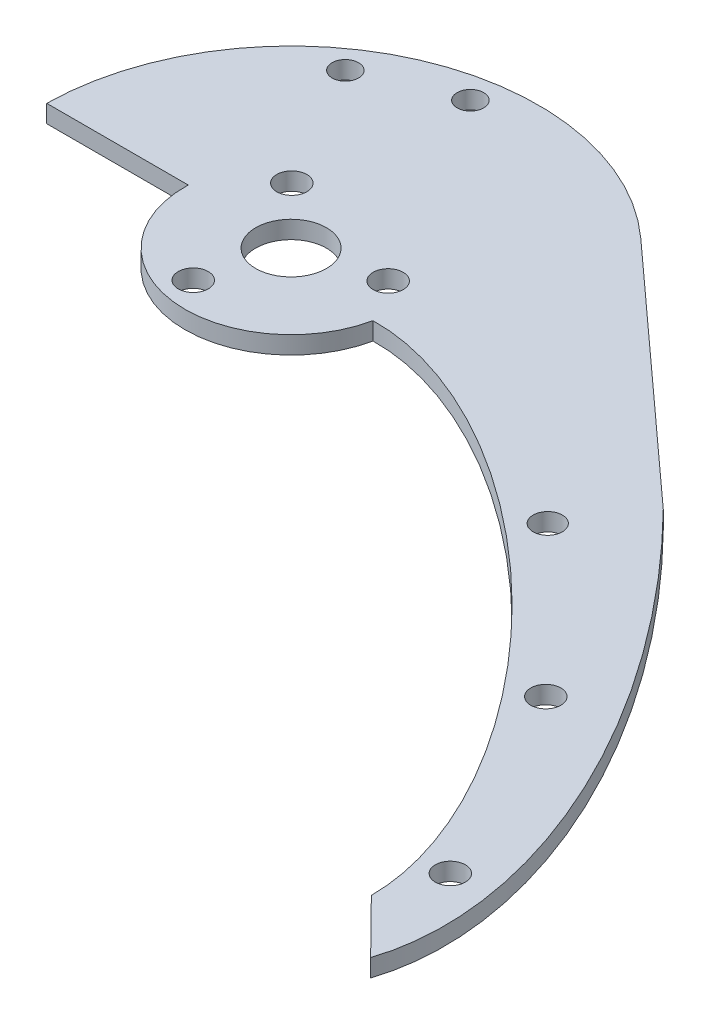
ISO-10303-21;
HEADER;
FILE_DESCRIPTION(('STEP AP214'),'2;1');
FILE_NAME('part.step','',(''),(''),'','','');
FILE_SCHEMA(('AUTOMOTIVE_DESIGN { 1 0 10303 214 1 1 1 1 }'));
ENDSEC;
DATA;
#1=APPLICATION_CONTEXT('core data for automotive mechanical design processes');
#2=APPLICATION_PROTOCOL_DEFINITION('international standard','automotive_design',2000,#1);
#3=PRODUCT_CONTEXT('',#1,'mechanical');
#4=PRODUCT('Part','Part','',(#3));
#5=PRODUCT_RELATED_PRODUCT_CATEGORY('part','',(#4));
#6=PRODUCT_DEFINITION_FORMATION('','',#4);
#7=PRODUCT_DEFINITION_CONTEXT('part definition',#1,'design');
#8=PRODUCT_DEFINITION('design','',#6,#7);
#9=PRODUCT_DEFINITION_SHAPE('','',#8);
#10=(LENGTH_UNIT() NAMED_UNIT(*) SI_UNIT(.MILLI.,.METRE.));
#11=(NAMED_UNIT(*) PLANE_ANGLE_UNIT() SI_UNIT($,.RADIAN.));
#12=(NAMED_UNIT(*) SI_UNIT($,.STERADIAN.) SOLID_ANGLE_UNIT());
#13=UNCERTAINTY_MEASURE_WITH_UNIT(LENGTH_MEASURE(1.E-05),#10,'distance_accuracy_value','');
#14=(GEOMETRIC_REPRESENTATION_CONTEXT(3) GLOBAL_UNCERTAINTY_ASSIGNED_CONTEXT((#13)) GLOBAL_UNIT_ASSIGNED_CONTEXT((#10,
#11,#12)) REPRESENTATION_CONTEXT('',''));
#15=CARTESIAN_POINT('',(0.,0.,0.));
#16=DIRECTION('',(0.,0.,1.));
#17=DIRECTION('',(1.,0.,0.));
#18=AXIS2_PLACEMENT_3D('',#15,#16,#17);
#19=CARTESIAN_POINT('',(35.1255795593791,2.,35.5836150583064));
#20=DIRECTION('',(0.,1.,0.));
#21=DIRECTION('',(0.,0.,1.));
#22=AXIS2_PLACEMENT_3D('',#19,#20,#21);
#23=PLANE('',#22);
#24=CARTESIAN_POINT('',(41.4835959621782,2.,12.4554883742596));
#25=DIRECTION('',(0.,1.,0.));
#26=DIRECTION('',(0.,0.,1.));
#27=AXIS2_PLACEMENT_3D('',#24,#25,#26);
#28=CIRCLE('',#27,1.65);
#29=CARTESIAN_POINT('',(41.4835959621782,2.,14.1054883742596));
#30=VERTEX_POINT('',#29);
#31=EDGE_CURVE('E194',#30,#30,#28,.T.);
#32=ORIENTED_EDGE('',*,*,#31,.F.);
#33=EDGE_LOOP('',(#32));
#34=FACE_BOUND('',#33,.T.);
#35=CARTESIAN_POINT('',(70.257880668249,2.,52.2439784797545));
#36=DIRECTION('',(0.,1.,0.));
#37=DIRECTION('',(0.,0.,1.));
#38=AXIS2_PLACEMENT_3D('',#35,#36,#37);
#39=CIRCLE('',#38,1.7);
#40=CARTESIAN_POINT('',(70.257880668249,2.,53.9439784797545));
#41=VERTEX_POINT('',#40);
#42=EDGE_CURVE('E200',#41,#41,#39,.T.);
#43=ORIENTED_EDGE('',*,*,#42,.F.);
#44=EDGE_LOOP('',(#43));
#45=FACE_BOUND('',#44,.T.);
#46=CARTESIAN_POINT('',(58.3341330111079,2.,29.5257554387853));
#47=DIRECTION('',(0.,1.,0.));
#48=DIRECTION('',(0.,0.,1.));
#49=AXIS2_PLACEMENT_3D('',#46,#47,#48);
#50=CIRCLE('',#49,1.7);
#51=CARTESIAN_POINT('',(58.3341330111079,2.,31.2257554387853));
#52=VERTEX_POINT('',#51);
#53=EDGE_CURVE('E182',#52,#52,#50,.T.);
#54=ORIENTED_EDGE('',*,*,#53,.F.);
#55=EDGE_LOOP('',(#54));
#56=FACE_BOUND('',#55,.T.);
#57=CARTESIAN_POINT('',(-14.3394109087762,2.,-20.4788011072248));
#58=DIRECTION('',(0.,1.,0.));
#59=DIRECTION('',(0.,0.,-1.));
#60=AXIS2_PLACEMENT_3D('',#57,#58,#59);
#61=CIRCLE('',#60,1.5);
#62=CARTESIAN_POINT('',(-14.3394109087762,2.,-21.9788011072248));
#63=VERTEX_POINT('',#62);
#64=EDGE_CURVE('E189',#63,#63,#61,.T.);
#65=ORIENTED_EDGE('',*,*,#64,.F.);
#66=EDGE_LOOP('',(#65));
#67=FACE_BOUND('',#66,.T.);
#68=CARTESIAN_POINT('',(-4.34120444167328,2.,-24.6201938253052));
#69=DIRECTION('',(0.,1.,0.));
#70=DIRECTION('',(0.,0.,1.));
#71=AXIS2_PLACEMENT_3D('',#68,#69,#70);
#72=CIRCLE('',#71,1.5);
#73=CARTESIAN_POINT('',(-4.34120444167328,2.,-23.1201938253052));
#74=VERTEX_POINT('',#73);
#75=EDGE_CURVE('E176',#74,#74,#72,.T.);
#76=ORIENTED_EDGE('',*,*,#75,.F.);
#77=EDGE_LOOP('',(#76));
#78=FACE_BOUND('',#77,.T.);
#79=CARTESIAN_POINT('',(8.70823878816048,2.,-2.2730106045457));
#80=DIRECTION('',(0.,1.,0.));
#81=DIRECTION('',(0.,0.,1.));
#82=AXIS2_PLACEMENT_3D('',#79,#80,#81);
#83=CIRCLE('',#82,1.7);
#84=CARTESIAN_POINT('',(8.70823878816048,2.,-0.573010604545707));
#85=VERTEX_POINT('',#84);
#86=EDGE_CURVE('E161',#85,#85,#83,.T.);
#87=ORIENTED_EDGE('',*,*,#86,.F.);
#88=EDGE_LOOP('',(#87));
#89=FACE_BOUND('',#88,.T.);
#90=CARTESIAN_POINT('',(0.,2.,0.));
#91=DIRECTION('',(0.,1.,0.));
#92=DIRECTION('',(0.,0.,1.));
#93=AXIS2_PLACEMENT_3D('',#90,#91,#92);
#94=CIRCLE('',#93,4.);
#95=CARTESIAN_POINT('',(0.,2.,4.));
#96=VERTEX_POINT('',#95);
#97=EDGE_CURVE('E153',#96,#96,#94,.T.);
#98=ORIENTED_EDGE('',*,*,#97,.F.);
#99=EDGE_LOOP('',(#98));
#100=FACE_BOUND('',#99,.T.);
#101=CARTESIAN_POINT('',(0.,2.,0.));
#102=DIRECTION('',(0.,1.,0.));
#103=DIRECTION('',(0.,0.,1.));
#104=AXIS2_PLACEMENT_3D('',#101,#102,#103);
#105=CIRCLE('',#104,28.);
#106=CARTESIAN_POINT('',(18.8288086844172,2.,-20.7238018598329));
#107=VERTEX_POINT('',#106);
#108=CARTESIAN_POINT('',(-27.9976502789953,2.,-0.362737997837238));
#109=VERTEX_POINT('',#108);
#110=EDGE_CURVE('E52',#107,#109,#105,.T.);
#111=ORIENTED_EDGE('',*,*,#110,.T.);
#112=DIRECTION('',(1.,0.,0.));
#113=VECTOR('',#112,1.);
#114=CARTESIAN_POINT('',(-11.9945162947459,2.,-0.362737997837313));
#115=LINE('',#114,#113);
#116=CARTESIAN_POINT('',(-11.9945162947459,2.,-0.362737997837313));
#117=VERTEX_POINT('',#116);
#118=EDGE_CURVE('E93',#109,#117,#115,.T.);
#119=ORIENTED_EDGE('',*,*,#118,.T.);
#120=CARTESIAN_POINT('',(0.,2.,0.));
#121=DIRECTION('',(0.,1.,0.));
#122=DIRECTION('',(0.,0.,1.));
#123=AXIS2_PLACEMENT_3D('',#120,#121,#122);
#124=CIRCLE('',#123,12.);
#125=CARTESIAN_POINT('',(11.7417923440434,2.,2.47594679857322));
#126=VERTEX_POINT('',#125);
#127=EDGE_CURVE('E145',#117,#126,#124,.T.);
#128=ORIENTED_EDGE('',*,*,#127,.T.);
#129=CARTESIAN_POINT('',(35.1255795593791,2.,35.5836150583064));
#130=DIRECTION('',(0.,-1.,0.));
#131=DIRECTION('',(-0.702511591187581,0.,-0.711672301166129));
#132=AXIS2_PLACEMENT_3D('',#129,#130,#131);
#133=ELLIPSE('',#132,43.,18.);
#134=CARTESIAN_POINT('',(67.9374513426321,2.,58.8591033245058));
#135=VERTEX_POINT('',#134);
#136=EDGE_CURVE('E110',#126,#135,#133,.T.);
#137=ORIENTED_EDGE('',*,*,#136,.T.);
#138=DIRECTION('',(0.70251159118758,0.,0.71167230116613));
#139=VECTOR('',#138,1.);
#140=CARTESIAN_POINT('',(67.9374513426321,2.,58.8591033245058));
#141=LINE('',#140,#139);
#142=CARTESIAN_POINT('',(73.9918053149363,2.,64.9924057177948));
#143=VERTEX_POINT('',#142);
#144=EDGE_CURVE('E104',#135,#143,#141,.T.);
#145=ORIENTED_EDGE('',*,*,#144,.T.);
#146=CARTESIAN_POINT('',(25.290417282753,2.,25.6202028419806));
#147=DIRECTION('',(0.,1.,0.));
#148=DIRECTION('',(0.702511591187581,0.,0.711672301166129));
#149=AXIS2_PLACEMENT_3D('',#146,#147,#148);
#150=ELLIPSE('',#149,64.,30.);
#151=CARTESIAN_POINT('',(46.6405863177367,2.,4.54485510635302));
#152=VERTEX_POINT('',#151);
#153=EDGE_CURVE('E108',#143,#152,#150,.T.);
#154=ORIENTED_EDGE('',*,*,#153,.T.);
#155=DIRECTION('',(-0.740135780708319,0.,-0.672457453014901));
#156=VECTOR('',#155,1.);
#157=CARTESIAN_POINT('',(46.6405863177367,2.,4.54485510635303));
#158=LINE('',#157,#156);
#159=EDGE_CURVE('E124',#152,#107,#158,.T.);
#160=ORIENTED_EDGE('',*,*,#159,.T.);
#161=EDGE_LOOP('',(#111,#119,#128,#137,#145,#154,#160));
#162=FACE_BOUND('',#161,.T.);
#163=CARTESIAN_POINT('',(-6.32260432068822,2.,-6.40505071049517));
#164=DIRECTION('',(0.,1.,0.));
#165=DIRECTION('',(0.,0.,1.));
#166=AXIS2_PLACEMENT_3D('',#163,#164,#165);
#167=CIRCLE('',#166,1.7);
#168=CARTESIAN_POINT('',(-6.32260432068822,2.,-4.70505071049517));
#169=VERTEX_POINT('',#168);
#170=EDGE_CURVE('E154',#169,#169,#167,.T.);
#171=ORIENTED_EDGE('',*,*,#170,.F.);
#172=EDGE_LOOP('',(#171));
#173=FACE_BOUND('',#172,.T.);
#174=CARTESIAN_POINT('',(-2.38563446747228,2.,8.67806131504083));
#175=DIRECTION('',(0.,1.,0.));
#176=DIRECTION('',(0.,0.,1.));
#177=AXIS2_PLACEMENT_3D('',#174,#175,#176);
#178=CIRCLE('',#177,1.7);
#179=CARTESIAN_POINT('',(-2.38563446747228,2.,10.3780613150408));
#180=VERTEX_POINT('',#179);
#181=EDGE_CURVE('E167',#180,#180,#178,.T.);
#182=ORIENTED_EDGE('',*,*,#181,.F.);
#183=EDGE_LOOP('',(#182));
#184=FACE_BOUND('',#183,.T.);
#185=ADVANCED_FACE('F35',(#34,#45,#56,#67,#78,#89,#100,#162,#173,#184),#23,.T.);
#186=CARTESIAN_POINT('',(35.1255795593791,0.,35.5836150583064));
#187=DIRECTION('',(0.,1.,0.));
#188=DIRECTION('',(0.,0.,1.));
#189=AXIS2_PLACEMENT_3D('',#186,#187,#188);
#190=PLANE('',#189);
#191=CARTESIAN_POINT('',(41.4835959621782,0.,12.4554883742596));
#192=DIRECTION('',(0.,1.,0.));
#193=DIRECTION('',(0.,0.,1.));
#194=AXIS2_PLACEMENT_3D('',#191,#192,#193);
#195=CIRCLE('',#194,1.65);
#196=CARTESIAN_POINT('',(41.4835959621782,0.,14.1054883742596));
#197=VERTEX_POINT('',#196);
#198=EDGE_CURVE('E197',#197,#197,#195,.T.);
#199=ORIENTED_EDGE('',*,*,#198,.T.);
#200=EDGE_LOOP('',(#199));
#201=FACE_BOUND('',#200,.T.);
#202=CARTESIAN_POINT('',(70.257880668249,0.,52.2439784797545));
#203=DIRECTION('',(0.,1.,0.));
#204=DIRECTION('',(0.,0.,1.));
#205=AXIS2_PLACEMENT_3D('',#202,#203,#204);
#206=CIRCLE('',#205,1.7);
#207=CARTESIAN_POINT('',(70.257880668249,0.,53.9439784797545));
#208=VERTEX_POINT('',#207);
#209=EDGE_CURVE('E186',#208,#208,#206,.T.);
#210=ORIENTED_EDGE('',*,*,#209,.T.);
#211=EDGE_LOOP('',(#210));
#212=FACE_BOUND('',#211,.T.);
#213=CARTESIAN_POINT('',(58.3341330111079,0.,29.5257554387853));
#214=DIRECTION('',(0.,1.,0.));
#215=DIRECTION('',(0.,0.,1.));
#216=AXIS2_PLACEMENT_3D('',#213,#214,#215);
#217=CIRCLE('',#216,1.7);
#218=CARTESIAN_POINT('',(58.3341330111079,0.,31.2257554387853));
#219=VERTEX_POINT('',#218);
#220=EDGE_CURVE('E185',#219,#219,#217,.T.);
#221=ORIENTED_EDGE('',*,*,#220,.T.);
#222=EDGE_LOOP('',(#221));
#223=FACE_BOUND('',#222,.T.);
#224=CARTESIAN_POINT('',(-14.3394109087762,0.,-20.4788011072248));
#225=DIRECTION('',(0.,1.,0.));
#226=DIRECTION('',(0.,0.,-1.));
#227=AXIS2_PLACEMENT_3D('',#224,#225,#226);
#228=CIRCLE('',#227,1.5);
#229=CARTESIAN_POINT('',(-14.3394109087762,0.,-21.9788011072248));
#230=VERTEX_POINT('',#229);
#231=EDGE_CURVE('E179',#230,#230,#228,.T.);
#232=ORIENTED_EDGE('',*,*,#231,.T.);
#233=EDGE_LOOP('',(#232));
#234=FACE_BOUND('',#233,.T.);
#235=CARTESIAN_POINT('',(-4.34120444167328,0.,-24.6201938253052));
#236=DIRECTION('',(0.,1.,0.));
#237=DIRECTION('',(0.,0.,1.));
#238=AXIS2_PLACEMENT_3D('',#235,#236,#237);
#239=CIRCLE('',#238,1.5);
#240=CARTESIAN_POINT('',(-4.34120444167328,0.,-23.1201938253052));
#241=VERTEX_POINT('',#240);
#242=EDGE_CURVE('E173',#241,#241,#239,.T.);
#243=ORIENTED_EDGE('',*,*,#242,.T.);
#244=EDGE_LOOP('',(#243));
#245=FACE_BOUND('',#244,.T.);
#246=DIRECTION('',(1.,0.,0.));
#247=VECTOR('',#246,1.);
#248=CARTESIAN_POINT('',(-11.9945162947459,0.,-0.362737997837313));
#249=LINE('',#248,#247);
#250=CARTESIAN_POINT('',(-27.9976502789953,0.,-0.362737997837238));
#251=VERTEX_POINT('',#250);
#252=CARTESIAN_POINT('',(-11.9945162947459,0.,-0.362737997837313));
#253=VERTEX_POINT('',#252);
#254=EDGE_CURVE('E157',#251,#253,#249,.T.);
#255=ORIENTED_EDGE('',*,*,#254,.F.);
#256=CARTESIAN_POINT('',(0.,0.,0.));
#257=DIRECTION('',(0.,1.,0.));
#258=DIRECTION('',(0.,0.,-1.));
#259=AXIS2_PLACEMENT_3D('',#256,#257,#258);
#260=CIRCLE('',#259,28.);
#261=CARTESIAN_POINT('',(18.8288086844172,0.,-20.7238018598329));
#262=VERTEX_POINT('',#261);
#263=EDGE_CURVE('E149',#262,#251,#260,.T.);
#264=ORIENTED_EDGE('',*,*,#263,.F.);
#265=DIRECTION('',(-0.740135780708319,0.,-0.672457453014901));
#266=VECTOR('',#265,1.);
#267=CARTESIAN_POINT('',(46.6405863177367,0.,4.54485510635303));
#268=LINE('',#267,#266);
#269=CARTESIAN_POINT('',(46.6405863177367,0.,4.54485510635302));
#270=VERTEX_POINT('',#269);
#271=EDGE_CURVE('E86',#270,#262,#268,.T.);
#272=ORIENTED_EDGE('',*,*,#271,.F.);
#273=CARTESIAN_POINT('',(25.290417282753,0.,25.6202028419806));
#274=DIRECTION('',(0.,1.,0.));
#275=DIRECTION('',(0.702511591187581,0.,0.711672301166129));
#276=AXIS2_PLACEMENT_3D('',#273,#274,#275);
#277=ELLIPSE('',#276,64.,30.);
#278=CARTESIAN_POINT('',(73.9918053149363,0.,64.9924057177948));
#279=VERTEX_POINT('',#278);
#280=EDGE_CURVE('E79',#279,#270,#277,.T.);
#281=ORIENTED_EDGE('',*,*,#280,.F.);
#282=DIRECTION('',(0.70251159118758,0.,0.71167230116613));
#283=VECTOR('',#282,1.);
#284=CARTESIAN_POINT('',(67.9374513426321,0.,58.8591033245058));
#285=LINE('',#284,#283);
#286=CARTESIAN_POINT('',(67.9374513426321,0.,58.8591033245058));
#287=VERTEX_POINT('',#286);
#288=EDGE_CURVE('E118',#287,#279,#285,.T.);
#289=ORIENTED_EDGE('',*,*,#288,.F.);
#290=CARTESIAN_POINT('',(35.1255795593791,0.,35.5836150583064));
#291=DIRECTION('',(0.,-1.,0.));
#292=DIRECTION('',(-0.702511591187581,0.,-0.711672301166129));
#293=AXIS2_PLACEMENT_3D('',#290,#291,#292);
#294=ELLIPSE('',#293,43.,18.);
#295=CARTESIAN_POINT('',(11.7417923440434,0.,2.47594679857322));
#296=VERTEX_POINT('',#295);
#297=EDGE_CURVE('E291',#296,#287,#294,.T.);
#298=ORIENTED_EDGE('',*,*,#297,.F.);
#299=CARTESIAN_POINT('',(0.,0.,0.));
#300=DIRECTION('',(0.,1.,0.));
#301=DIRECTION('',(0.,0.,1.));
#302=AXIS2_PLACEMENT_3D('',#299,#300,#301);
#303=CIRCLE('',#302,12.);
#304=EDGE_CURVE('E278',#253,#296,#303,.T.);
#305=ORIENTED_EDGE('',*,*,#304,.F.);
#306=EDGE_LOOP('',(#255,#264,#272,#281,#289,#298,#305));
#307=FACE_BOUND('',#306,.T.);
#308=CARTESIAN_POINT('',(0.,0.,0.));
#309=DIRECTION('',(0.,1.,0.));
#310=DIRECTION('',(0.,0.,1.));
#311=AXIS2_PLACEMENT_3D('',#308,#309,#310);
#312=CIRCLE('',#311,4.);
#313=CARTESIAN_POINT('',(0.,0.,4.));
#314=VERTEX_POINT('',#313);
#315=EDGE_CURVE('E150',#314,#314,#312,.T.);
#316=ORIENTED_EDGE('',*,*,#315,.T.);
#317=EDGE_LOOP('',(#316));
#318=FACE_BOUND('',#317,.T.);
#319=CARTESIAN_POINT('',(-6.32260432068822,0.,-6.40505071049517));
#320=DIRECTION('',(0.,1.,0.));
#321=DIRECTION('',(0.,0.,1.));
#322=AXIS2_PLACEMENT_3D('',#319,#320,#321);
#323=CIRCLE('',#322,1.7);
#324=CARTESIAN_POINT('',(-6.32260432068822,0.,-4.70505071049517));
#325=VERTEX_POINT('',#324);
#326=EDGE_CURVE('E158',#325,#325,#323,.T.);
#327=ORIENTED_EDGE('',*,*,#326,.T.);
#328=EDGE_LOOP('',(#327));
#329=FACE_BOUND('',#328,.T.);
#330=CARTESIAN_POINT('',(8.70823878816048,0.,-2.2730106045457));
#331=DIRECTION('',(0.,1.,0.));
#332=DIRECTION('',(0.,0.,1.));
#333=AXIS2_PLACEMENT_3D('',#330,#331,#332);
#334=CIRCLE('',#333,1.7);
#335=CARTESIAN_POINT('',(8.70823878816048,0.,-0.573010604545707));
#336=VERTEX_POINT('',#335);
#337=EDGE_CURVE('E164',#336,#336,#334,.T.);
#338=ORIENTED_EDGE('',*,*,#337,.T.);
#339=EDGE_LOOP('',(#338));
#340=FACE_BOUND('',#339,.T.);
#341=CARTESIAN_POINT('',(-2.38563446747228,0.,8.67806131504083));
#342=DIRECTION('',(0.,1.,0.));
#343=DIRECTION('',(0.,0.,1.));
#344=AXIS2_PLACEMENT_3D('',#341,#342,#343);
#345=CIRCLE('',#344,1.7);
#346=CARTESIAN_POINT('',(-2.38563446747228,0.,10.3780613150408));
#347=VERTEX_POINT('',#346);
#348=EDGE_CURVE('E170',#347,#347,#345,.T.);
#349=ORIENTED_EDGE('',*,*,#348,.T.);
#350=EDGE_LOOP('',(#349));
#351=FACE_BOUND('',#350,.T.);
#352=ADVANCED_FACE('F206',(#201,#212,#223,#234,#245,#307,#318,#329,#340,#351),#190,.F.);
#353=CARTESIAN_POINT('',(-11.9945162947459,2.,-0.362737997837313));
#354=DIRECTION('',(0.,0.,-1.));
#355=DIRECTION('',(-1.,0.,0.));
#356=AXIS2_PLACEMENT_3D('',#353,#354,#355);
#357=PLANE('',#356);
#358=ORIENTED_EDGE('',*,*,#254,.T.);
#359=DIRECTION('',(0.,-1.,0.));
#360=VECTOR('',#359,1.);
#361=CARTESIAN_POINT('',(-11.9945162947459,2.,-0.362737997837313));
#362=LINE('',#361,#360);
#363=EDGE_CURVE('E44',#117,#253,#362,.T.);
#364=ORIENTED_EDGE('',*,*,#363,.F.);
#365=ORIENTED_EDGE('',*,*,#118,.F.);
#366=DIRECTION('',(0.,-1.,0.));
#367=VECTOR('',#366,1.);
#368=CARTESIAN_POINT('',(-27.9976502789953,2.,-0.362737997837238));
#369=LINE('',#368,#367);
#370=EDGE_CURVE('E11',#109,#251,#369,.T.);
#371=ORIENTED_EDGE('',*,*,#370,.T.);
#372=EDGE_LOOP('',(#358,#364,#365,#371));
#373=FACE_BOUND('',#372,.T.);
#374=ADVANCED_FACE('F37',(#373),#357,.F.);
#375=CARTESIAN_POINT('',(0.,2.,0.));
#376=DIRECTION('',(0.,-1.,0.));
#377=DIRECTION('',(0.,0.,-1.));
#378=AXIS2_PLACEMENT_3D('',#375,#376,#377);
#379=CYLINDRICAL_SURFACE('',#378,12.);
#380=ORIENTED_EDGE('',*,*,#304,.T.);
#381=DIRECTION('',(0.,-1.,0.));
#382=VECTOR('',#381,1.);
#383=CARTESIAN_POINT('',(11.7417923440434,2.,2.47594679857322));
#384=LINE('',#383,#382);
#385=EDGE_CURVE('E290',#126,#296,#384,.T.);
#386=ORIENTED_EDGE('',*,*,#385,.F.);
#387=ORIENTED_EDGE('',*,*,#127,.F.);
#388=ORIENTED_EDGE('',*,*,#363,.T.);
#389=EDGE_LOOP('',(#380,#386,#387,#388));
#390=FACE_BOUND('',#389,.T.);
#391=ADVANCED_FACE('F141',(#390),#379,.T.);
#392=DIRECTION('',(0.,-1.,0.));
#393=VECTOR('',#392,1.);
#394=SURFACE_OF_LINEAR_EXTRUSION('',#133,#393);
#395=ORIENTED_EDGE('',*,*,#297,.T.);
#396=DIRECTION('',(0.,-1.,0.));
#397=VECTOR('',#396,1.);
#398=CARTESIAN_POINT('',(67.9374513426321,2.,58.8591033245058));
#399=LINE('',#398,#397);
#400=EDGE_CURVE('E119',#135,#287,#399,.T.);
#401=ORIENTED_EDGE('',*,*,#400,.F.);
#402=ORIENTED_EDGE('',*,*,#136,.F.);
#403=ORIENTED_EDGE('',*,*,#385,.T.);
#404=EDGE_LOOP('',(#395,#401,#402,#403));
#405=FACE_BOUND('',#404,.T.);
#406=ADVANCED_FACE('F139',(#405),#394,.F.);
#407=CARTESIAN_POINT('',(67.9374513426321,2.,58.8591033245058));
#408=DIRECTION('',(0.71167230116613,0.,-0.70251159118758));
#409=DIRECTION('',(-0.70251159118758,0.,-0.71167230116613));
#410=AXIS2_PLACEMENT_3D('',#407,#408,#409);
#411=PLANE('',#410);
#412=ORIENTED_EDGE('',*,*,#288,.T.);
#413=DIRECTION('',(0.,-1.,0.));
#414=VECTOR('',#413,1.);
#415=CARTESIAN_POINT('',(73.9918053149363,2.,64.9924057177948));
#416=LINE('',#415,#414);
#417=EDGE_CURVE('E115',#143,#279,#416,.T.);
#418=ORIENTED_EDGE('',*,*,#417,.F.);
#419=ORIENTED_EDGE('',*,*,#144,.F.);
#420=ORIENTED_EDGE('',*,*,#400,.T.);
#421=EDGE_LOOP('',(#412,#418,#419,#420));
#422=FACE_BOUND('',#421,.T.);
#423=ADVANCED_FACE('F116',(#422),#411,.F.);
#424=DIRECTION('',(0.,-1.,0.));
#425=VECTOR('',#424,1.);
#426=SURFACE_OF_LINEAR_EXTRUSION('',#150,#425);
#427=ORIENTED_EDGE('',*,*,#280,.T.);
#428=DIRECTION('',(0.,-1.,0.));
#429=VECTOR('',#428,1.);
#430=CARTESIAN_POINT('',(46.6405863177367,2.,4.54485510635302));
#431=LINE('',#430,#429);
#432=EDGE_CURVE('E120',#152,#270,#431,.T.);
#433=ORIENTED_EDGE('',*,*,#432,.F.);
#434=ORIENTED_EDGE('',*,*,#153,.F.);
#435=ORIENTED_EDGE('',*,*,#417,.T.);
#436=EDGE_LOOP('',(#427,#433,#434,#435));
#437=FACE_BOUND('',#436,.T.);
#438=ADVANCED_FACE('F122',(#437),#426,.F.);
#439=CARTESIAN_POINT('',(46.6405863177367,2.,4.54485510635303));
#440=DIRECTION('',(-0.672457453014901,0.,0.740135780708319));
#441=DIRECTION('',(0.740135780708319,0.,0.672457453014901));
#442=AXIS2_PLACEMENT_3D('',#439,#440,#441);
#443=PLANE('',#442);
#444=ORIENTED_EDGE('',*,*,#271,.T.);
#445=DIRECTION('',(0.,-1.,0.));
#446=VECTOR('',#445,1.);
#447=CARTESIAN_POINT('',(18.8288086844172,2.,-20.7238018598329));
#448=LINE('',#447,#446);
#449=EDGE_CURVE('E126',#107,#262,#448,.T.);
#450=ORIENTED_EDGE('',*,*,#449,.F.);
#451=ORIENTED_EDGE('',*,*,#159,.F.);
#452=ORIENTED_EDGE('',*,*,#432,.T.);
#453=EDGE_LOOP('',(#444,#450,#451,#452));
#454=FACE_BOUND('',#453,.T.);
#455=ADVANCED_FACE('F135',(#454),#443,.F.);
#456=CARTESIAN_POINT('',(0.,2.,0.));
#457=DIRECTION('',(0.,-1.,0.));
#458=DIRECTION('',(0.,0.,-1.));
#459=AXIS2_PLACEMENT_3D('',#456,#457,#458);
#460=CYLINDRICAL_SURFACE('',#459,28.);
#461=ORIENTED_EDGE('',*,*,#263,.T.);
#462=ORIENTED_EDGE('',*,*,#370,.F.);
#463=ORIENTED_EDGE('',*,*,#110,.F.);
#464=ORIENTED_EDGE('',*,*,#449,.T.);
#465=EDGE_LOOP('',(#461,#462,#463,#464));
#466=FACE_BOUND('',#465,.T.);
#467=ADVANCED_FACE('F235',(#466),#460,.T.);
#468=CARTESIAN_POINT('',(0.,2.,0.));
#469=DIRECTION('',(0.,-1.,0.));
#470=DIRECTION('',(0.,0.,-1.));
#471=AXIS2_PLACEMENT_3D('',#468,#469,#470);
#472=CYLINDRICAL_SURFACE('',#471,4.);
#473=ORIENTED_EDGE('',*,*,#97,.T.);
#474=EDGE_LOOP('',(#473));
#475=FACE_BOUND('',#474,.T.);
#476=ORIENTED_EDGE('',*,*,#315,.F.);
#477=EDGE_LOOP('',(#476));
#478=FACE_BOUND('',#477,.T.);
#479=ADVANCED_FACE('F231',(#475,#478),#472,.F.);
#480=CARTESIAN_POINT('',(-6.32260432068822,2.,-6.40505071049517));
#481=DIRECTION('',(0.,-1.,0.));
#482=DIRECTION('',(0.,0.,-1.));
#483=AXIS2_PLACEMENT_3D('',#480,#481,#482);
#484=CYLINDRICAL_SURFACE('',#483,1.7);
#485=ORIENTED_EDGE('',*,*,#170,.T.);
#486=EDGE_LOOP('',(#485));
#487=FACE_BOUND('',#486,.T.);
#488=ORIENTED_EDGE('',*,*,#326,.F.);
#489=EDGE_LOOP('',(#488));
#490=FACE_BOUND('',#489,.T.);
#491=ADVANCED_FACE('F234',(#487,#490),#484,.F.);
#492=CARTESIAN_POINT('',(8.70823878816048,2.,-2.2730106045457));
#493=DIRECTION('',(0.,-1.,0.));
#494=DIRECTION('',(0.,0.,-1.));
#495=AXIS2_PLACEMENT_3D('',#492,#493,#494);
#496=CYLINDRICAL_SURFACE('',#495,1.7);
#497=ORIENTED_EDGE('',*,*,#86,.T.);
#498=EDGE_LOOP('',(#497));
#499=FACE_BOUND('',#498,.T.);
#500=ORIENTED_EDGE('',*,*,#337,.F.);
#501=EDGE_LOOP('',(#500));
#502=FACE_BOUND('',#501,.T.);
#503=ADVANCED_FACE('F252',(#499,#502),#496,.F.);
#504=CARTESIAN_POINT('',(-2.38563446747228,2.,8.67806131504083));
#505=DIRECTION('',(0.,-1.,0.));
#506=DIRECTION('',(0.,0.,-1.));
#507=AXIS2_PLACEMENT_3D('',#504,#505,#506);
#508=CYLINDRICAL_SURFACE('',#507,1.7);
#509=ORIENTED_EDGE('',*,*,#181,.T.);
#510=EDGE_LOOP('',(#509));
#511=FACE_BOUND('',#510,.T.);
#512=ORIENTED_EDGE('',*,*,#348,.F.);
#513=EDGE_LOOP('',(#512));
#514=FACE_BOUND('',#513,.T.);
#515=ADVANCED_FACE('F249',(#511,#514),#508,.F.);
#516=CARTESIAN_POINT('',(-4.34120444167328,0.,-24.6201938253052));
#517=DIRECTION('',(0.,1.,0.));
#518=DIRECTION('',(0.,0.,1.));
#519=AXIS2_PLACEMENT_3D('',#516,#517,#518);
#520=CYLINDRICAL_SURFACE('',#519,1.5);
#521=ORIENTED_EDGE('',*,*,#242,.F.);
#522=EDGE_LOOP('',(#521));
#523=FACE_BOUND('',#522,.T.);
#524=ORIENTED_EDGE('',*,*,#75,.T.);
#525=EDGE_LOOP('',(#524));
#526=FACE_BOUND('',#525,.T.);
#527=ADVANCED_FACE('F251',(#523,#526),#520,.F.);
#528=CARTESIAN_POINT('',(-14.3394109087762,0.,-20.4788011072248));
#529=DIRECTION('',(0.,1.,0.));
#530=DIRECTION('',(0.,0.,1.));
#531=AXIS2_PLACEMENT_3D('',#528,#529,#530);
#532=CYLINDRICAL_SURFACE('',#531,1.5);
#533=ORIENTED_EDGE('',*,*,#231,.F.);
#534=EDGE_LOOP('',(#533));
#535=FACE_BOUND('',#534,.T.);
#536=ORIENTED_EDGE('',*,*,#64,.T.);
#537=EDGE_LOOP('',(#536));
#538=FACE_BOUND('',#537,.T.);
#539=ADVANCED_FACE('F259',(#535,#538),#532,.F.);
#540=CARTESIAN_POINT('',(58.3341330111079,0.,29.5257554387853));
#541=DIRECTION('',(0.,1.,0.));
#542=DIRECTION('',(0.,0.,1.));
#543=AXIS2_PLACEMENT_3D('',#540,#541,#542);
#544=CYLINDRICAL_SURFACE('',#543,1.7);
#545=ORIENTED_EDGE('',*,*,#220,.F.);
#546=EDGE_LOOP('',(#545));
#547=FACE_BOUND('',#546,.T.);
#548=ORIENTED_EDGE('',*,*,#53,.T.);
#549=EDGE_LOOP('',(#548));
#550=FACE_BOUND('',#549,.T.);
#551=ADVANCED_FACE('F213',(#547,#550),#544,.F.);
#552=CARTESIAN_POINT('',(70.257880668249,0.,52.2439784797545));
#553=DIRECTION('',(0.,1.,0.));
#554=DIRECTION('',(0.,0.,1.));
#555=AXIS2_PLACEMENT_3D('',#552,#553,#554);
#556=CYLINDRICAL_SURFACE('',#555,1.7);
#557=ORIENTED_EDGE('',*,*,#209,.F.);
#558=EDGE_LOOP('',(#557));
#559=FACE_BOUND('',#558,.T.);
#560=ORIENTED_EDGE('',*,*,#42,.T.);
#561=EDGE_LOOP('',(#560));
#562=FACE_BOUND('',#561,.T.);
#563=ADVANCED_FACE('F209',(#559,#562),#556,.F.);
#564=CARTESIAN_POINT('',(41.4835959621782,0.,12.4554883742596));
#565=DIRECTION('',(0.,1.,0.));
#566=DIRECTION('',(0.,0.,1.));
#567=AXIS2_PLACEMENT_3D('',#564,#565,#566);
#568=CYLINDRICAL_SURFACE('',#567,1.65);
#569=ORIENTED_EDGE('',*,*,#198,.F.);
#570=EDGE_LOOP('',(#569));
#571=FACE_BOUND('',#570,.T.);
#572=ORIENTED_EDGE('',*,*,#31,.T.);
#573=EDGE_LOOP('',(#572));
#574=FACE_BOUND('',#573,.T.);
#575=ADVANCED_FACE('F212',(#571,#574),#568,.F.);
#576=CLOSED_SHELL('',(#185,#352,#374,#391,#406,#423,#438,#455,#467,#479,#491,#503,#515,#527,
#539,#551,#563,#575));
#577=MANIFOLD_SOLID_BREP('B2',#576);
#578=ADVANCED_BREP_SHAPE_REPRESENTATION('',(#18,#577),#14);
#579=SHAPE_DEFINITION_REPRESENTATION(#9,#578);
ENDSEC;
END-ISO-10303-21;
